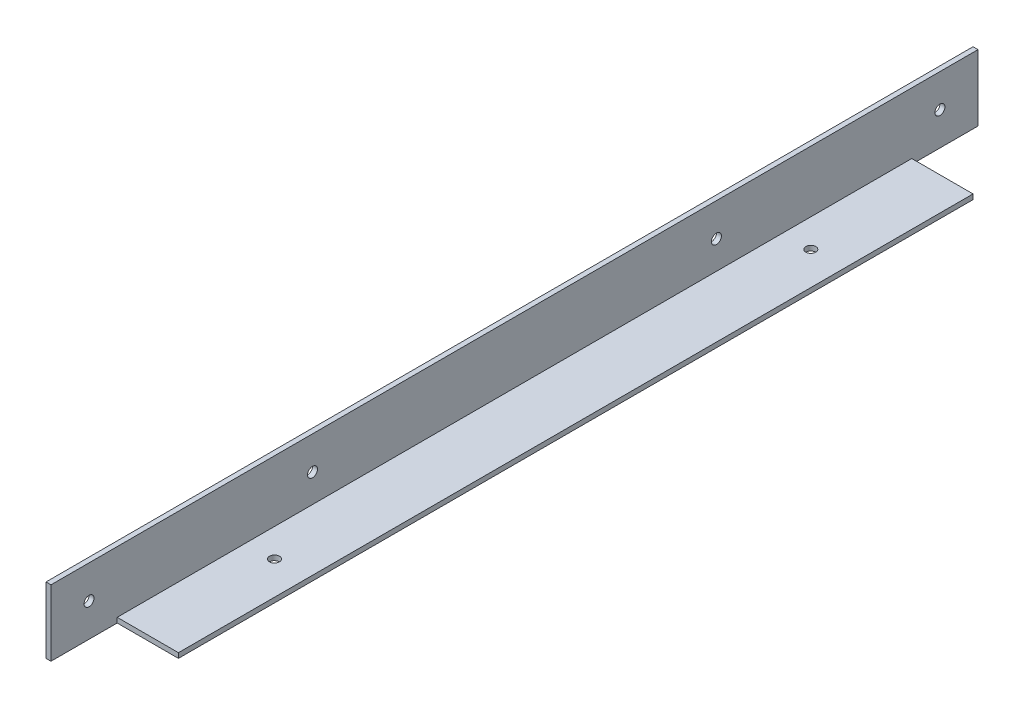
ISO-10303-21;
HEADER;
FILE_DESCRIPTION(('STEP AP214'),'2;1');
FILE_NAME('part.step','',(''),(''),'','','');
FILE_SCHEMA(('AUTOMOTIVE_DESIGN { 1 0 10303 214 1 1 1 1 }'));
ENDSEC;
DATA;
#1=APPLICATION_CONTEXT('core data for automotive mechanical design processes');
#2=APPLICATION_PROTOCOL_DEFINITION('international standard','automotive_design',2000,#1);
#3=PRODUCT_CONTEXT('',#1,'mechanical');
#4=PRODUCT('Part','Part','',(#3));
#5=PRODUCT_RELATED_PRODUCT_CATEGORY('part','',(#4));
#6=PRODUCT_DEFINITION_FORMATION('','',#4);
#7=PRODUCT_DEFINITION_CONTEXT('part definition',#1,'design');
#8=PRODUCT_DEFINITION('design','',#6,#7);
#9=PRODUCT_DEFINITION_SHAPE('','',#8);
#10=(LENGTH_UNIT() NAMED_UNIT(*) SI_UNIT(.MILLI.,.METRE.));
#11=(NAMED_UNIT(*) PLANE_ANGLE_UNIT() SI_UNIT($,.RADIAN.));
#12=(NAMED_UNIT(*) SI_UNIT($,.STERADIAN.) SOLID_ANGLE_UNIT());
#13=UNCERTAINTY_MEASURE_WITH_UNIT(LENGTH_MEASURE(1.E-05),#10,'distance_accuracy_value','');
#14=(GEOMETRIC_REPRESENTATION_CONTEXT(3) GLOBAL_UNCERTAINTY_ASSIGNED_CONTEXT((#13)) GLOBAL_UNIT_ASSIGNED_CONTEXT((#10,
#11,#12)) REPRESENTATION_CONTEXT('',''));
#15=CARTESIAN_POINT('',(0.,0.,0.));
#16=DIRECTION('',(0.,0.,1.));
#17=DIRECTION('',(1.,0.,0.));
#18=AXIS2_PLACEMENT_3D('',#15,#16,#17);
#19=CARTESIAN_POINT('',(0.,0.,0.));
#20=DIRECTION('',(0.,0.,1.));
#21=DIRECTION('',(1.,0.,0.));
#22=AXIS2_PLACEMENT_3D('',#19,#20,#21);
#23=PLANE('',#22);
#24=DIRECTION('',(0.,-1.,0.));
#25=VECTOR('',#24,1.);
#26=CARTESIAN_POINT('',(1.5,0.,0.));
#27=LINE('',#26,#25);
#28=CARTESIAN_POINT('',(1.5,1.5,0.));
#29=VERTEX_POINT('',#28);
#30=CARTESIAN_POINT('',(1.5,0.,0.));
#31=VERTEX_POINT('',#30);
#32=EDGE_CURVE('E11',#29,#31,#27,.T.);
#33=ORIENTED_EDGE('',*,*,#32,.F.);
#34=DIRECTION('',(-1.,0.,0.));
#35=VECTOR('',#34,1.);
#36=CARTESIAN_POINT('',(20.,1.5,0.));
#37=LINE('',#36,#35);
#38=CARTESIAN_POINT('',(20.,1.5,0.));
#39=VERTEX_POINT('',#38);
#40=EDGE_CURVE('E132',#39,#29,#37,.T.);
#41=ORIENTED_EDGE('',*,*,#40,.F.);
#42=DIRECTION('',(0.,1.,0.));
#43=VECTOR('',#42,1.);
#44=CARTESIAN_POINT('',(20.,0.,0.));
#45=LINE('',#44,#43);
#46=CARTESIAN_POINT('',(20.,0.,0.));
#47=VERTEX_POINT('',#46);
#48=EDGE_CURVE('E133',#47,#39,#45,.T.);
#49=ORIENTED_EDGE('',*,*,#48,.F.);
#50=DIRECTION('',(1.,0.,0.));
#51=VECTOR('',#50,1.);
#52=CARTESIAN_POINT('',(0.,0.,0.));
#53=LINE('',#52,#51);
#54=EDGE_CURVE('E138',#31,#47,#53,.T.);
#55=ORIENTED_EDGE('',*,*,#54,.F.);
#56=EDGE_LOOP('',(#33,#41,#49,#55));
#57=FACE_BOUND('',#56,.T.);
#58=ADVANCED_FACE('F31',(#57),#23,.F.);
#59=CARTESIAN_POINT('',(0.,20.,240.));
#60=DIRECTION('',(1.,0.,0.));
#61=DIRECTION('',(0.,1.,0.));
#62=AXIS2_PLACEMENT_3D('',#59,#60,#61);
#63=PLANE('',#62);
#64=CARTESIAN_POINT('',(0.,10.,59.));
#65=DIRECTION('',(1.,0.,0.));
#66=DIRECTION('',(0.,1.,0.));
#67=AXIS2_PLACEMENT_3D('',#64,#65,#66);
#68=CIRCLE('',#67,1.5);
#69=CARTESIAN_POINT('',(0.,11.5,59.));
#70=VERTEX_POINT('',#69);
#71=EDGE_CURVE('E254',#70,#70,#68,.T.);
#72=ORIENTED_EDGE('',*,*,#71,.T.);
#73=EDGE_LOOP('',(#72));
#74=FACE_BOUND('',#73,.T.);
#75=CARTESIAN_POINT('',(0.,10.,181.));
#76=DIRECTION('',(1.,0.,0.));
#77=DIRECTION('',(0.,1.,0.));
#78=AXIS2_PLACEMENT_3D('',#75,#76,#77);
#79=CIRCLE('',#78,1.5);
#80=CARTESIAN_POINT('',(0.,11.5,181.));
#81=VERTEX_POINT('',#80);
#82=EDGE_CURVE('E248',#81,#81,#79,.T.);
#83=ORIENTED_EDGE('',*,*,#82,.T.);
#84=EDGE_LOOP('',(#83));
#85=FACE_BOUND('',#84,.T.);
#86=CARTESIAN_POINT('',(0.,10.,-8.5));
#87=DIRECTION('',(1.,0.,0.));
#88=DIRECTION('',(0.,1.,0.));
#89=AXIS2_PLACEMENT_3D('',#86,#87,#88);
#90=CIRCLE('',#89,1.5);
#91=CARTESIAN_POINT('',(0.,11.5,-8.5));
#92=VERTEX_POINT('',#91);
#93=EDGE_CURVE('E242',#92,#92,#90,.T.);
#94=ORIENTED_EDGE('',*,*,#93,.T.);
#95=EDGE_LOOP('',(#94));
#96=FACE_BOUND('',#95,.T.);
#97=CARTESIAN_POINT('',(0.,10.,248.5));
#98=DIRECTION('',(1.,0.,0.));
#99=DIRECTION('',(0.,1.,0.));
#100=AXIS2_PLACEMENT_3D('',#97,#98,#99);
#101=CIRCLE('',#100,1.50000000000003);
#102=CARTESIAN_POINT('',(0.,11.5,248.5));
#103=VERTEX_POINT('',#102);
#104=EDGE_CURVE('E120',#103,#103,#101,.T.);
#105=ORIENTED_EDGE('',*,*,#104,.T.);
#106=EDGE_LOOP('',(#105));
#107=FACE_BOUND('',#106,.T.);
#108=DIRECTION('',(0.,0.,-1.));
#109=VECTOR('',#108,1.);
#110=CARTESIAN_POINT('',(0.,20.,240.));
#111=LINE('',#110,#109);
#112=CARTESIAN_POINT('',(0.,20.,260.));
#113=VERTEX_POINT('',#112);
#114=CARTESIAN_POINT('',(0.,20.,-20.));
#115=VERTEX_POINT('',#114);
#116=EDGE_CURVE('E149',#113,#115,#111,.T.);
#117=ORIENTED_EDGE('',*,*,#116,.T.);
#118=DIRECTION('',(0.,1.,0.));
#119=VECTOR('',#118,1.);
#120=CARTESIAN_POINT('',(0.,20.,-20.));
#121=LINE('',#120,#119);
#122=CARTESIAN_POINT('',(0.,0.,-20.));
#123=VERTEX_POINT('',#122);
#124=EDGE_CURVE('E111',#123,#115,#121,.T.);
#125=ORIENTED_EDGE('',*,*,#124,.F.);
#126=DIRECTION('',(0.,0.,-1.));
#127=VECTOR('',#126,1.);
#128=CARTESIAN_POINT('',(0.,0.,240.));
#129=LINE('',#128,#127);
#130=CARTESIAN_POINT('',(0.,0.,260.));
#131=VERTEX_POINT('',#130);
#132=EDGE_CURVE('E40',#131,#123,#129,.T.);
#133=ORIENTED_EDGE('',*,*,#132,.F.);
#134=DIRECTION('',(0.,-1.,0.));
#135=VECTOR('',#134,1.);
#136=CARTESIAN_POINT('',(0.,0.,260.));
#137=LINE('',#136,#135);
#138=EDGE_CURVE('E125',#113,#131,#137,.T.);
#139=ORIENTED_EDGE('',*,*,#138,.F.);
#140=EDGE_LOOP('',(#117,#125,#133,#139));
#141=FACE_BOUND('',#140,.T.);
#142=ADVANCED_FACE('F33',(#74,#85,#96,#107,#141),#63,.F.);
#143=CARTESIAN_POINT('',(0.,0.,240.));
#144=DIRECTION('',(0.,1.,0.));
#145=DIRECTION('',(0.,0.,1.));
#146=AXIS2_PLACEMENT_3D('',#143,#144,#145);
#147=PLANE('',#146);
#148=CARTESIAN_POINT('',(10.,0.,201.));
#149=DIRECTION('',(0.,1.,0.));
#150=DIRECTION('',(-1.,0.,0.));
#151=AXIS2_PLACEMENT_3D('',#148,#149,#150);
#152=CIRCLE('',#151,1.5);
#153=CARTESIAN_POINT('',(8.5,0.,201.));
#154=VERTEX_POINT('',#153);
#155=EDGE_CURVE('E180',#154,#154,#152,.T.);
#156=ORIENTED_EDGE('',*,*,#155,.T.);
#157=EDGE_LOOP('',(#156));
#158=FACE_BOUND('',#157,.T.);
#159=CARTESIAN_POINT('',(10.,0.,39.));
#160=DIRECTION('',(0.,1.,0.));
#161=DIRECTION('',(-1.,0.,0.));
#162=AXIS2_PLACEMENT_3D('',#159,#160,#161);
#163=CIRCLE('',#162,1.5);
#164=CARTESIAN_POINT('',(8.5,0.,39.));
#165=VERTEX_POINT('',#164);
#166=EDGE_CURVE('E144',#165,#165,#163,.T.);
#167=ORIENTED_EDGE('',*,*,#166,.T.);
#168=EDGE_LOOP('',(#167));
#169=FACE_BOUND('',#168,.T.);
#170=ORIENTED_EDGE('',*,*,#132,.T.);
#171=DIRECTION('',(-1.,0.,0.));
#172=VECTOR('',#171,1.);
#173=CARTESIAN_POINT('',(0.,0.,-20.));
#174=LINE('',#173,#172);
#175=CARTESIAN_POINT('',(1.5,0.,-20.));
#176=VERTEX_POINT('',#175);
#177=EDGE_CURVE('E102',#176,#123,#174,.T.);
#178=ORIENTED_EDGE('',*,*,#177,.F.);
#179=DIRECTION('',(0.,0.,1.));
#180=VECTOR('',#179,1.);
#181=CARTESIAN_POINT('',(1.5,0.,-20.));
#182=LINE('',#181,#180);
#183=EDGE_CURVE('E106',#176,#31,#182,.T.);
#184=ORIENTED_EDGE('',*,*,#183,.T.);
#185=ORIENTED_EDGE('',*,*,#54,.T.);
#186=DIRECTION('',(0.,0.,-1.));
#187=VECTOR('',#186,1.);
#188=CARTESIAN_POINT('',(20.,0.,240.));
#189=LINE('',#188,#187);
#190=CARTESIAN_POINT('',(20.,0.,240.));
#191=VERTEX_POINT('',#190);
#192=EDGE_CURVE('E156',#191,#47,#189,.T.);
#193=ORIENTED_EDGE('',*,*,#192,.F.);
#194=DIRECTION('',(1.,0.,0.));
#195=VECTOR('',#194,1.);
#196=CARTESIAN_POINT('',(0.,0.,240.));
#197=LINE('',#196,#195);
#198=CARTESIAN_POINT('',(1.5,0.,240.));
#199=VERTEX_POINT('',#198);
#200=EDGE_CURVE('E72',#199,#191,#197,.T.);
#201=ORIENTED_EDGE('',*,*,#200,.F.);
#202=DIRECTION('',(0.,0.,-1.));
#203=VECTOR('',#202,1.);
#204=CARTESIAN_POINT('',(1.5,0.,260.));
#205=LINE('',#204,#203);
#206=CARTESIAN_POINT('',(1.5,0.,260.));
#207=VERTEX_POINT('',#206);
#208=EDGE_CURVE('E173',#207,#199,#205,.T.);
#209=ORIENTED_EDGE('',*,*,#208,.F.);
#210=DIRECTION('',(1.,0.,0.));
#211=VECTOR('',#210,1.);
#212=CARTESIAN_POINT('',(1.5,0.,260.));
#213=LINE('',#212,#211);
#214=EDGE_CURVE('E193',#131,#207,#213,.T.);
#215=ORIENTED_EDGE('',*,*,#214,.F.);
#216=EDGE_LOOP('',(#170,#178,#184,#185,#193,#201,#209,#215));
#217=FACE_BOUND('',#216,.T.);
#218=ADVANCED_FACE('F104',(#158,#169,#217),#147,.F.);
#219=CARTESIAN_POINT('',(20.,0.,240.));
#220=DIRECTION('',(-1.,0.,0.));
#221=DIRECTION('',(0.,0.,1.));
#222=AXIS2_PLACEMENT_3D('',#219,#220,#221);
#223=PLANE('',#222);
#224=ORIENTED_EDGE('',*,*,#48,.T.);
#225=DIRECTION('',(0.,0.,-1.));
#226=VECTOR('',#225,1.);
#227=CARTESIAN_POINT('',(20.,1.5,240.));
#228=LINE('',#227,#226);
#229=CARTESIAN_POINT('',(20.,1.5,240.));
#230=VERTEX_POINT('',#229);
#231=EDGE_CURVE('E154',#230,#39,#228,.T.);
#232=ORIENTED_EDGE('',*,*,#231,.F.);
#233=DIRECTION('',(0.,1.,0.));
#234=VECTOR('',#233,1.);
#235=CARTESIAN_POINT('',(20.,0.,240.));
#236=LINE('',#235,#234);
#237=EDGE_CURVE('E136',#191,#230,#236,.T.);
#238=ORIENTED_EDGE('',*,*,#237,.F.);
#239=ORIENTED_EDGE('',*,*,#192,.T.);
#240=EDGE_LOOP('',(#224,#232,#238,#239));
#241=FACE_BOUND('',#240,.T.);
#242=ADVANCED_FACE('F167',(#241),#223,.F.);
#243=CARTESIAN_POINT('',(20.,1.5,240.));
#244=DIRECTION('',(0.,-1.,0.));
#245=DIRECTION('',(1.,0.,0.));
#246=AXIS2_PLACEMENT_3D('',#243,#244,#245);
#247=PLANE('',#246);
#248=CARTESIAN_POINT('',(10.,1.5,201.));
#249=DIRECTION('',(0.,1.,0.));
#250=DIRECTION('',(-1.,0.,0.));
#251=AXIS2_PLACEMENT_3D('',#248,#249,#250);
#252=CIRCLE('',#251,1.5);
#253=CARTESIAN_POINT('',(8.5,1.5,201.));
#254=VERTEX_POINT('',#253);
#255=EDGE_CURVE('E176',#254,#254,#252,.T.);
#256=ORIENTED_EDGE('',*,*,#255,.F.);
#257=EDGE_LOOP('',(#256));
#258=FACE_BOUND('',#257,.T.);
#259=CARTESIAN_POINT('',(10.,1.5,39.));
#260=DIRECTION('',(0.,1.,0.));
#261=DIRECTION('',(-1.,0.,0.));
#262=AXIS2_PLACEMENT_3D('',#259,#260,#261);
#263=CIRCLE('',#262,1.5);
#264=CARTESIAN_POINT('',(8.5,1.5,39.));
#265=VERTEX_POINT('',#264);
#266=EDGE_CURVE('E163',#265,#265,#263,.T.);
#267=ORIENTED_EDGE('',*,*,#266,.F.);
#268=EDGE_LOOP('',(#267));
#269=FACE_BOUND('',#268,.T.);
#270=ORIENTED_EDGE('',*,*,#40,.T.);
#271=DIRECTION('',(0.,0.,-1.));
#272=VECTOR('',#271,1.);
#273=CARTESIAN_POINT('',(1.5,1.5,240.));
#274=LINE('',#273,#272);
#275=CARTESIAN_POINT('',(1.5,1.5,240.));
#276=VERTEX_POINT('',#275);
#277=EDGE_CURVE('E153',#276,#29,#274,.T.);
#278=ORIENTED_EDGE('',*,*,#277,.F.);
#279=DIRECTION('',(-1.,0.,0.));
#280=VECTOR('',#279,1.);
#281=CARTESIAN_POINT('',(20.,1.5,240.));
#282=LINE('',#281,#280);
#283=EDGE_CURVE('E54',#230,#276,#282,.T.);
#284=ORIENTED_EDGE('',*,*,#283,.F.);
#285=ORIENTED_EDGE('',*,*,#231,.T.);
#286=EDGE_LOOP('',(#270,#278,#284,#285));
#287=FACE_BOUND('',#286,.T.);
#288=ADVANCED_FACE('F168',(#258,#269,#287),#247,.F.);
#289=CARTESIAN_POINT('',(1.5,1.5,240.));
#290=DIRECTION('',(-1.,0.,0.));
#291=DIRECTION('',(0.,-1.,0.));
#292=AXIS2_PLACEMENT_3D('',#289,#290,#291);
#293=PLANE('',#292);
#294=CARTESIAN_POINT('',(1.5,10.,59.));
#295=DIRECTION('',(1.,0.,0.));
#296=DIRECTION('',(0.,1.,0.));
#297=AXIS2_PLACEMENT_3D('',#294,#295,#296);
#298=CIRCLE('',#297,1.5);
#299=CARTESIAN_POINT('',(1.5,11.5,59.));
#300=VERTEX_POINT('',#299);
#301=EDGE_CURVE('E257',#300,#300,#298,.T.);
#302=ORIENTED_EDGE('',*,*,#301,.F.);
#303=EDGE_LOOP('',(#302));
#304=FACE_BOUND('',#303,.T.);
#305=CARTESIAN_POINT('',(1.5,10.,181.));
#306=DIRECTION('',(1.,0.,0.));
#307=DIRECTION('',(0.,1.,0.));
#308=AXIS2_PLACEMENT_3D('',#305,#306,#307);
#309=CIRCLE('',#308,1.5);
#310=CARTESIAN_POINT('',(1.5,11.5,181.));
#311=VERTEX_POINT('',#310);
#312=EDGE_CURVE('E251',#311,#311,#309,.T.);
#313=ORIENTED_EDGE('',*,*,#312,.F.);
#314=EDGE_LOOP('',(#313));
#315=FACE_BOUND('',#314,.T.);
#316=CARTESIAN_POINT('',(1.5,10.,-8.5));
#317=DIRECTION('',(1.,0.,0.));
#318=DIRECTION('',(0.,1.,0.));
#319=AXIS2_PLACEMENT_3D('',#316,#317,#318);
#320=CIRCLE('',#319,1.5);
#321=CARTESIAN_POINT('',(1.5,11.5,-8.5));
#322=VERTEX_POINT('',#321);
#323=EDGE_CURVE('E245',#322,#322,#320,.T.);
#324=ORIENTED_EDGE('',*,*,#323,.F.);
#325=EDGE_LOOP('',(#324));
#326=FACE_BOUND('',#325,.T.);
#327=CARTESIAN_POINT('',(1.5,10.,248.5));
#328=DIRECTION('',(1.,0.,0.));
#329=DIRECTION('',(0.,1.,0.));
#330=AXIS2_PLACEMENT_3D('',#327,#328,#329);
#331=CIRCLE('',#330,1.50000000000003);
#332=CARTESIAN_POINT('',(1.5,11.5,248.5));
#333=VERTEX_POINT('',#332);
#334=EDGE_CURVE('E239',#333,#333,#331,.T.);
#335=ORIENTED_EDGE('',*,*,#334,.F.);
#336=EDGE_LOOP('',(#335));
#337=FACE_BOUND('',#336,.T.);
#338=ORIENTED_EDGE('',*,*,#277,.T.);
#339=ORIENTED_EDGE('',*,*,#32,.T.);
#340=ORIENTED_EDGE('',*,*,#183,.F.);
#341=DIRECTION('',(0.,-1.,0.));
#342=VECTOR('',#341,1.);
#343=CARTESIAN_POINT('',(1.5,0.,-20.));
#344=LINE('',#343,#342);
#345=CARTESIAN_POINT('',(1.5,20.,-20.));
#346=VERTEX_POINT('',#345);
#347=EDGE_CURVE('E112',#346,#176,#344,.T.);
#348=ORIENTED_EDGE('',*,*,#347,.F.);
#349=DIRECTION('',(0.,0.,-1.));
#350=VECTOR('',#349,1.);
#351=CARTESIAN_POINT('',(1.5,20.,240.));
#352=LINE('',#351,#350);
#353=CARTESIAN_POINT('',(1.5,20.,260.));
#354=VERTEX_POINT('',#353);
#355=EDGE_CURVE('E151',#354,#346,#352,.T.);
#356=ORIENTED_EDGE('',*,*,#355,.F.);
#357=DIRECTION('',(0.,1.,0.));
#358=VECTOR('',#357,1.);
#359=CARTESIAN_POINT('',(1.5,20.,260.));
#360=LINE('',#359,#358);
#361=EDGE_CURVE('E175',#207,#354,#360,.T.);
#362=ORIENTED_EDGE('',*,*,#361,.F.);
#363=ORIENTED_EDGE('',*,*,#208,.T.);
#364=DIRECTION('',(0.,1.,0.));
#365=VECTOR('',#364,1.);
#366=CARTESIAN_POINT('',(1.5,20.,240.));
#367=LINE('',#366,#365);
#368=EDGE_CURVE('E48',#199,#276,#367,.T.);
#369=ORIENTED_EDGE('',*,*,#368,.T.);
#370=EDGE_LOOP('',(#338,#339,#340,#348,#356,#362,#363,#369));
#371=FACE_BOUND('',#370,.T.);
#372=ADVANCED_FACE('F123',(#304,#315,#326,#337,#371),#293,.F.);
#373=CARTESIAN_POINT('',(1.5,20.,240.));
#374=DIRECTION('',(0.,-1.,0.));
#375=DIRECTION('',(0.,0.,-1.));
#376=AXIS2_PLACEMENT_3D('',#373,#374,#375);
#377=PLANE('',#376);
#378=ORIENTED_EDGE('',*,*,#355,.T.);
#379=DIRECTION('',(1.,0.,0.));
#380=VECTOR('',#379,1.);
#381=CARTESIAN_POINT('',(1.5,20.,-20.));
#382=LINE('',#381,#380);
#383=EDGE_CURVE('E118',#115,#346,#382,.T.);
#384=ORIENTED_EDGE('',*,*,#383,.F.);
#385=ORIENTED_EDGE('',*,*,#116,.F.);
#386=DIRECTION('',(-1.,0.,0.));
#387=VECTOR('',#386,1.);
#388=CARTESIAN_POINT('',(0.,20.,260.));
#389=LINE('',#388,#387);
#390=EDGE_CURVE('E177',#354,#113,#389,.T.);
#391=ORIENTED_EDGE('',*,*,#390,.F.);
#392=EDGE_LOOP('',(#378,#384,#385,#391));
#393=FACE_BOUND('',#392,.T.);
#394=ADVANCED_FACE('F215',(#393),#377,.F.);
#395=CARTESIAN_POINT('',(0.,0.,240.));
#396=DIRECTION('',(0.,0.,1.));
#397=DIRECTION('',(1.,0.,0.));
#398=AXIS2_PLACEMENT_3D('',#395,#396,#397);
#399=PLANE('',#398);
#400=ORIENTED_EDGE('',*,*,#368,.F.);
#401=ORIENTED_EDGE('',*,*,#200,.T.);
#402=ORIENTED_EDGE('',*,*,#237,.T.);
#403=ORIENTED_EDGE('',*,*,#283,.T.);
#404=EDGE_LOOP('',(#400,#401,#402,#403));
#405=FACE_BOUND('',#404,.T.);
#406=ADVANCED_FACE('F166',(#405),#399,.T.);
#407=CARTESIAN_POINT('',(10.,0.,39.));
#408=DIRECTION('',(0.,1.,0.));
#409=DIRECTION('',(-1.,0.,0.));
#410=AXIS2_PLACEMENT_3D('',#407,#408,#409);
#411=CYLINDRICAL_SURFACE('',#410,1.5);
#412=ORIENTED_EDGE('',*,*,#166,.F.);
#413=EDGE_LOOP('',(#412));
#414=FACE_BOUND('',#413,.T.);
#415=ORIENTED_EDGE('',*,*,#266,.T.);
#416=EDGE_LOOP('',(#415));
#417=FACE_BOUND('',#416,.T.);
#418=ADVANCED_FACE('F206',(#414,#417),#411,.F.);
#419=CARTESIAN_POINT('',(10.,0.,201.));
#420=DIRECTION('',(0.,1.,0.));
#421=DIRECTION('',(-1.,0.,0.));
#422=AXIS2_PLACEMENT_3D('',#419,#420,#421);
#423=CYLINDRICAL_SURFACE('',#422,1.5);
#424=ORIENTED_EDGE('',*,*,#155,.F.);
#425=EDGE_LOOP('',(#424));
#426=FACE_BOUND('',#425,.T.);
#427=ORIENTED_EDGE('',*,*,#255,.T.);
#428=EDGE_LOOP('',(#427));
#429=FACE_BOUND('',#428,.T.);
#430=ADVANCED_FACE('F294',(#426,#429),#423,.F.);
#431=CARTESIAN_POINT('',(0.,20.,260.));
#432=DIRECTION('',(0.,0.,-1.));
#433=DIRECTION('',(-1.,0.,0.));
#434=AXIS2_PLACEMENT_3D('',#431,#432,#433);
#435=PLANE('',#434);
#436=ORIENTED_EDGE('',*,*,#138,.T.);
#437=ORIENTED_EDGE('',*,*,#214,.T.);
#438=ORIENTED_EDGE('',*,*,#361,.T.);
#439=ORIENTED_EDGE('',*,*,#390,.T.);
#440=EDGE_LOOP('',(#436,#437,#438,#439));
#441=FACE_BOUND('',#440,.T.);
#442=ADVANCED_FACE('F234',(#441),#435,.F.);
#443=CARTESIAN_POINT('',(1.5,20.,-20.));
#444=DIRECTION('',(0.,0.,1.));
#445=DIRECTION('',(1.,0.,0.));
#446=AXIS2_PLACEMENT_3D('',#443,#444,#445);
#447=PLANE('',#446);
#448=ORIENTED_EDGE('',*,*,#347,.T.);
#449=ORIENTED_EDGE('',*,*,#177,.T.);
#450=ORIENTED_EDGE('',*,*,#124,.T.);
#451=ORIENTED_EDGE('',*,*,#383,.T.);
#452=EDGE_LOOP('',(#448,#449,#450,#451));
#453=FACE_BOUND('',#452,.T.);
#454=ADVANCED_FACE('F116',(#453),#447,.F.);
#455=CARTESIAN_POINT('',(0.,10.,248.5));
#456=DIRECTION('',(1.,0.,0.));
#457=DIRECTION('',(0.,1.,0.));
#458=AXIS2_PLACEMENT_3D('',#455,#456,#457);
#459=CYLINDRICAL_SURFACE('',#458,1.50000000000003);
#460=ORIENTED_EDGE('',*,*,#104,.F.);
#461=EDGE_LOOP('',(#460));
#462=FACE_BOUND('',#461,.T.);
#463=ORIENTED_EDGE('',*,*,#334,.T.);
#464=EDGE_LOOP('',(#463));
#465=FACE_BOUND('',#464,.T.);
#466=ADVANCED_FACE('F277',(#462,#465),#459,.F.);
#467=CARTESIAN_POINT('',(0.,10.,-8.5));
#468=DIRECTION('',(1.,0.,0.));
#469=DIRECTION('',(0.,1.,0.));
#470=AXIS2_PLACEMENT_3D('',#467,#468,#469);
#471=CYLINDRICAL_SURFACE('',#470,1.5);
#472=ORIENTED_EDGE('',*,*,#93,.F.);
#473=EDGE_LOOP('',(#472));
#474=FACE_BOUND('',#473,.T.);
#475=ORIENTED_EDGE('',*,*,#323,.T.);
#476=EDGE_LOOP('',(#475));
#477=FACE_BOUND('',#476,.T.);
#478=ADVANCED_FACE('F279',(#474,#477),#471,.F.);
#479=CARTESIAN_POINT('',(0.,10.,181.));
#480=DIRECTION('',(1.,0.,0.));
#481=DIRECTION('',(0.,1.,0.));
#482=AXIS2_PLACEMENT_3D('',#479,#480,#481);
#483=CYLINDRICAL_SURFACE('',#482,1.5);
#484=ORIENTED_EDGE('',*,*,#82,.F.);
#485=EDGE_LOOP('',(#484));
#486=FACE_BOUND('',#485,.T.);
#487=ORIENTED_EDGE('',*,*,#312,.T.);
#488=EDGE_LOOP('',(#487));
#489=FACE_BOUND('',#488,.T.);
#490=ADVANCED_FACE('F267',(#486,#489),#483,.F.);
#491=CARTESIAN_POINT('',(0.,10.,59.));
#492=DIRECTION('',(1.,0.,0.));
#493=DIRECTION('',(0.,1.,0.));
#494=AXIS2_PLACEMENT_3D('',#491,#492,#493);
#495=CYLINDRICAL_SURFACE('',#494,1.5);
#496=ORIENTED_EDGE('',*,*,#71,.F.);
#497=EDGE_LOOP('',(#496));
#498=FACE_BOUND('',#497,.T.);
#499=ORIENTED_EDGE('',*,*,#301,.T.);
#500=EDGE_LOOP('',(#499));
#501=FACE_BOUND('',#500,.T.);
#502=ADVANCED_FACE('F264',(#498,#501),#495,.F.);
#503=CLOSED_SHELL('',(#58,#142,#218,#242,#288,#372,#394,#406,#418,#430,#442,#454,#466,#478,#490,#502));
#504=MANIFOLD_SOLID_BREP('B2',#503);
#505=ADVANCED_BREP_SHAPE_REPRESENTATION('',(#18,#504),#14);
#506=SHAPE_DEFINITION_REPRESENTATION(#9,#505);
ENDSEC;
END-ISO-10303-21;
